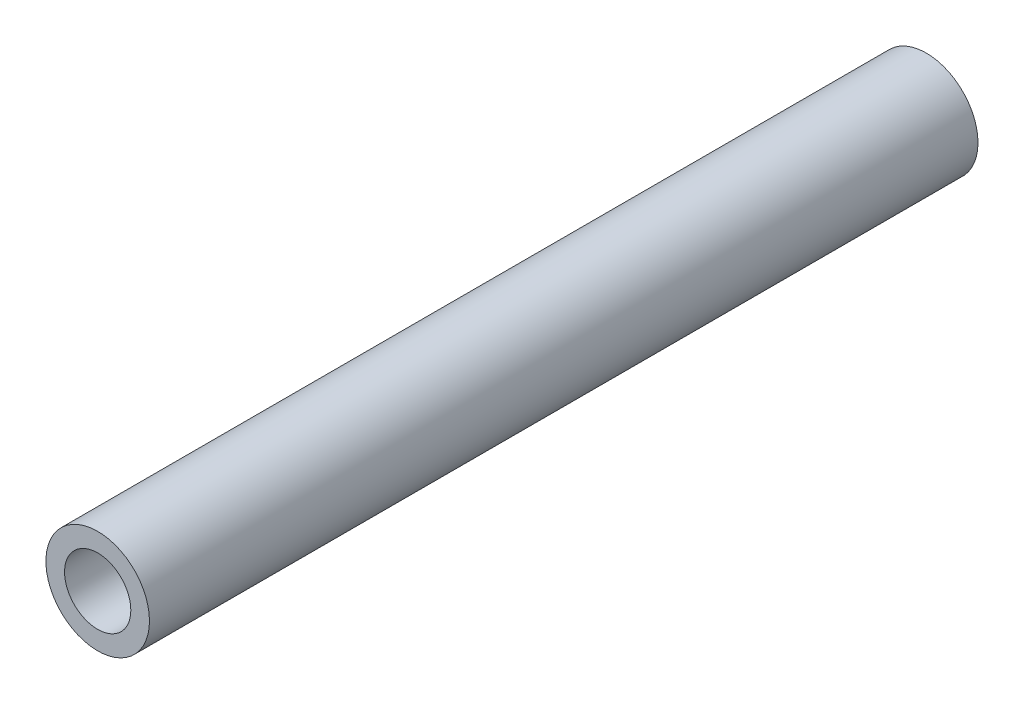
ISO-10303-21;
HEADER;
FILE_DESCRIPTION(('STEP AP214'),'2;1');
FILE_NAME('part.step','',(''),(''),'','','');
FILE_SCHEMA(('AUTOMOTIVE_DESIGN { 1 0 10303 214 1 1 1 1 }'));
ENDSEC;
DATA;
#1=APPLICATION_CONTEXT('core data for automotive mechanical design processes');
#2=APPLICATION_PROTOCOL_DEFINITION('international standard','automotive_design',2000,#1);
#3=PRODUCT_CONTEXT('',#1,'mechanical');
#4=PRODUCT('Part','Part','',(#3));
#5=PRODUCT_RELATED_PRODUCT_CATEGORY('part','',(#4));
#6=PRODUCT_DEFINITION_FORMATION('','',#4);
#7=PRODUCT_DEFINITION_CONTEXT('part definition',#1,'design');
#8=PRODUCT_DEFINITION('design','',#6,#7);
#9=PRODUCT_DEFINITION_SHAPE('','',#8);
#10=(LENGTH_UNIT() NAMED_UNIT(*) SI_UNIT(.MILLI.,.METRE.));
#11=(NAMED_UNIT(*) PLANE_ANGLE_UNIT() SI_UNIT($,.RADIAN.));
#12=(NAMED_UNIT(*) SI_UNIT($,.STERADIAN.) SOLID_ANGLE_UNIT());
#13=UNCERTAINTY_MEASURE_WITH_UNIT(LENGTH_MEASURE(1.E-05),#10,'distance_accuracy_value','');
#14=(GEOMETRIC_REPRESENTATION_CONTEXT(3) GLOBAL_UNCERTAINTY_ASSIGNED_CONTEXT((#13)) GLOBAL_UNIT_ASSIGNED_CONTEXT((#10,
#11,#12)) REPRESENTATION_CONTEXT('',''));
#15=CARTESIAN_POINT('',(0.,0.,0.));
#16=DIRECTION('',(0.,0.,1.));
#17=DIRECTION('',(1.,0.,0.));
#18=AXIS2_PLACEMENT_3D('',#15,#16,#17);
#19=CARTESIAN_POINT('',(0.,0.,40.));
#20=DIRECTION('',(0.,0.,1.));
#21=DIRECTION('',(1.,0.,0.));
#22=AXIS2_PLACEMENT_3D('',#19,#20,#21);
#23=PLANE('',#22);
#24=CARTESIAN_POINT('',(0.,0.,40.));
#25=DIRECTION('',(0.,0.,1.));
#26=DIRECTION('',(1.,0.,0.));
#27=AXIS2_PLACEMENT_3D('',#24,#25,#26);
#28=CIRCLE('',#27,2.5);
#29=CARTESIAN_POINT('',(2.5,0.,40.));
#30=VERTEX_POINT('',#29);
#31=EDGE_CURVE('E10',#30,#30,#28,.T.);
#32=ORIENTED_EDGE('',*,*,#31,.T.);
#33=EDGE_LOOP('',(#32));
#34=FACE_BOUND('',#33,.T.);
#35=CARTESIAN_POINT('',(0.,0.,40.));
#36=DIRECTION('',(0.,0.,1.));
#37=DIRECTION('',(1.,0.,0.));
#38=AXIS2_PLACEMENT_3D('',#35,#36,#37);
#39=CIRCLE('',#38,1.6);
#40=CARTESIAN_POINT('',(1.6,0.,40.));
#41=VERTEX_POINT('',#40);
#42=EDGE_CURVE('E50',#41,#41,#39,.T.);
#43=ORIENTED_EDGE('',*,*,#42,.F.);
#44=EDGE_LOOP('',(#43));
#45=FACE_BOUND('',#44,.T.);
#46=ADVANCED_FACE('F37',(#34,#45),#23,.T.);
#47=CARTESIAN_POINT('',(0.,0.,0.));
#48=DIRECTION('',(0.,0.,1.));
#49=DIRECTION('',(1.,0.,0.));
#50=AXIS2_PLACEMENT_3D('',#47,#48,#49);
#51=PLANE('',#50);
#52=CARTESIAN_POINT('',(0.,0.,0.));
#53=DIRECTION('',(0.,0.,1.));
#54=DIRECTION('',(1.,0.,0.));
#55=AXIS2_PLACEMENT_3D('',#52,#53,#54);
#56=CIRCLE('',#55,2.5);
#57=CARTESIAN_POINT('',(2.5,0.,0.));
#58=VERTEX_POINT('',#57);
#59=EDGE_CURVE('E41',#58,#58,#56,.T.);
#60=ORIENTED_EDGE('',*,*,#59,.F.);
#61=EDGE_LOOP('',(#60));
#62=FACE_BOUND('',#61,.T.);
#63=CARTESIAN_POINT('',(0.,0.,0.));
#64=DIRECTION('',(0.,0.,1.));
#65=DIRECTION('',(1.,0.,0.));
#66=AXIS2_PLACEMENT_3D('',#63,#64,#65);
#67=CIRCLE('',#66,1.6);
#68=CARTESIAN_POINT('',(1.6,0.,0.));
#69=VERTEX_POINT('',#68);
#70=EDGE_CURVE('E52',#69,#69,#67,.T.);
#71=ORIENTED_EDGE('',*,*,#70,.T.);
#72=EDGE_LOOP('',(#71));
#73=FACE_BOUND('',#72,.T.);
#74=ADVANCED_FACE('F64',(#62,#73),#51,.F.);
#75=CARTESIAN_POINT('',(0.,0.,40.));
#76=DIRECTION('',(0.,0.,-1.));
#77=DIRECTION('',(-1.,0.,0.));
#78=AXIS2_PLACEMENT_3D('',#75,#76,#77);
#79=CYLINDRICAL_SURFACE('',#78,2.5);
#80=ORIENTED_EDGE('',*,*,#31,.F.);
#81=EDGE_LOOP('',(#80));
#82=FACE_BOUND('',#81,.T.);
#83=ORIENTED_EDGE('',*,*,#59,.T.);
#84=EDGE_LOOP('',(#83));
#85=FACE_BOUND('',#84,.T.);
#86=ADVANCED_FACE('F39',(#82,#85),#79,.T.);
#87=CARTESIAN_POINT('',(0.,0.,40.));
#88=DIRECTION('',(0.,0.,-1.));
#89=DIRECTION('',(-1.,0.,0.));
#90=AXIS2_PLACEMENT_3D('',#87,#88,#89);
#91=CYLINDRICAL_SURFACE('',#90,1.6);
#92=ORIENTED_EDGE('',*,*,#42,.T.);
#93=EDGE_LOOP('',(#92));
#94=FACE_BOUND('',#93,.T.);
#95=ORIENTED_EDGE('',*,*,#70,.F.);
#96=EDGE_LOOP('',(#95));
#97=FACE_BOUND('',#96,.T.);
#98=ADVANCED_FACE('F60',(#94,#97),#91,.F.);
#99=CLOSED_SHELL('',(#46,#74,#86,#98));
#100=MANIFOLD_SOLID_BREP('B2',#99);
#101=ADVANCED_BREP_SHAPE_REPRESENTATION('',(#18,#100),#14);
#102=SHAPE_DEFINITION_REPRESENTATION(#9,#101);
ENDSEC;
END-ISO-10303-21;
